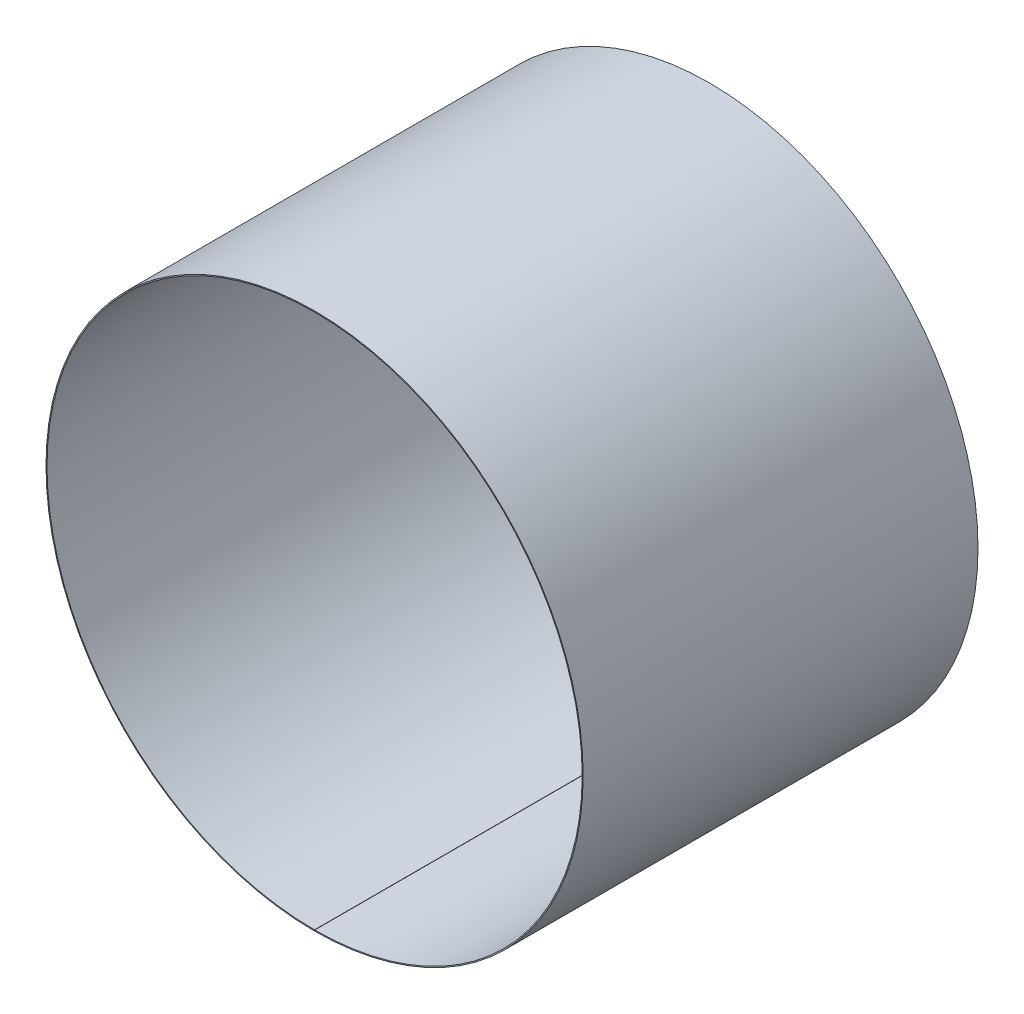
ISO-10303-21;
HEADER;
FILE_DESCRIPTION(('STEP AP214'),'2;1');
FILE_NAME('part.step','',(''),(''),'','','');
FILE_SCHEMA(('AUTOMOTIVE_DESIGN { 1 0 10303 214 1 1 1 1 }'));
ENDSEC;
DATA;
#1=APPLICATION_CONTEXT('core data for automotive mechanical design processes');
#2=APPLICATION_PROTOCOL_DEFINITION('international standard','automotive_design',2000,#1);
#3=PRODUCT_CONTEXT('',#1,'mechanical');
#4=PRODUCT('Part','Part','',(#3));
#5=PRODUCT_RELATED_PRODUCT_CATEGORY('part','',(#4));
#6=PRODUCT_DEFINITION_FORMATION('','',#4);
#7=PRODUCT_DEFINITION_CONTEXT('part definition',#1,'design');
#8=PRODUCT_DEFINITION('design','',#6,#7);
#9=PRODUCT_DEFINITION_SHAPE('','',#8);
#10=(LENGTH_UNIT() NAMED_UNIT(*) SI_UNIT(.MILLI.,.METRE.));
#11=(NAMED_UNIT(*) PLANE_ANGLE_UNIT() SI_UNIT($,.RADIAN.));
#12=(NAMED_UNIT(*) SI_UNIT($,.STERADIAN.) SOLID_ANGLE_UNIT());
#13=UNCERTAINTY_MEASURE_WITH_UNIT(LENGTH_MEASURE(1.E-05),#10,'distance_accuracy_value','');
#14=(GEOMETRIC_REPRESENTATION_CONTEXT(3) GLOBAL_UNCERTAINTY_ASSIGNED_CONTEXT((#13)) GLOBAL_UNIT_ASSIGNED_CONTEXT((#10,
#11,#12)) REPRESENTATION_CONTEXT('',''));
#15=CARTESIAN_POINT('',(0.,0.,0.));
#16=DIRECTION('',(0.,0.,1.));
#17=DIRECTION('',(1.,0.,0.));
#18=AXIS2_PLACEMENT_3D('',#15,#16,#17);
#19=CARTESIAN_POINT('',(3.32253755758183E-13,-1.11022302462516E-13,762.));
#20=DIRECTION('',(0.,0.,1.));
#21=DIRECTION('',(1.,0.,0.));
#22=AXIS2_PLACEMENT_3D('',#19,#20,#21);
#23=PLANE('',#22);
#24=DIRECTION('',(-0.000491865663494751,-0.999999879034077,0.));
#25=VECTOR('',#24,1.);
#26=CARTESIAN_POINT('',(-0.254474748738396,-517.366299057937,762.));
#27=LINE('',#26,#25);
#28=CARTESIAN_POINT('',(-0.254000000000181,-516.401099174693,762.));
#29=VERTEX_POINT('',#28);
#30=CARTESIAN_POINT('',(-0.254949497476992,-518.33149894118,762.));
#31=VERTEX_POINT('',#30);
#32=EDGE_CURVE('E11',#29,#31,#27,.T.);
#33=ORIENTED_EDGE('',*,*,#32,.F.);
#34=CARTESIAN_POINT('',(3.32253755758183E-13,-1.11022302462516E-13,762.));
#35=DIRECTION('',(0.,0.,1.));
#36=DIRECTION('',(1.,0.,0.));
#37=AXIS2_PLACEMENT_3D('',#34,#35,#36);
#38=CIRCLE('',#37,516.401161641636);
#39=CARTESIAN_POINT('',(0.2539999999924,-516.401099174693,762.));
#40=VERTEX_POINT('',#39);
#41=EDGE_CURVE('E98',#29,#40,#38,.F.);
#42=ORIENTED_EDGE('',*,*,#41,.T.);
#43=DIRECTION('',(0.000491865663478488,-0.999999879034077,0.));
#44=VECTOR('',#43,1.);
#45=CARTESIAN_POINT('',(0.254474748730647,-517.366299057937,762.));
#46=LINE('',#45,#44);
#47=CARTESIAN_POINT('',(0.254949497469179,-518.331498941181,762.));
#48=VERTEX_POINT('',#47);
#49=EDGE_CURVE('E46',#40,#48,#46,.T.);
#50=ORIENTED_EDGE('',*,*,#49,.T.);
#51=CARTESIAN_POINT('',(3.32253755758183E-13,-1.11022302462516E-13,762.));
#52=DIRECTION('',(0.,0.,1.));
#53=DIRECTION('',(1.,0.,0.));
#54=AXIS2_PLACEMENT_3D('',#51,#52,#53);
#55=CIRCLE('',#54,518.331561641636);
#56=EDGE_CURVE('E92',#31,#48,#55,.F.);
#57=ORIENTED_EDGE('',*,*,#56,.F.);
#58=EDGE_LOOP('',(#33,#42,#50,#57));
#59=FACE_BOUND('',#58,.T.);
#60=ADVANCED_FACE('F36',(#59),#23,.T.);
#61=CARTESIAN_POINT('',(0.254474748730647,-517.366299057937,381.));
#62=DIRECTION('',(-0.999999879034077,-0.000491865663478488,0.));
#63=DIRECTION('',(0.,0.,-1.));
#64=AXIS2_PLACEMENT_3D('',#61,#62,#63);
#65=PLANE('',#64);
#66=ORIENTED_EDGE('',*,*,#49,.F.);
#67=DIRECTION('',(0.,0.,1.));
#68=VECTOR('',#67,1.);
#69=CARTESIAN_POINT('',(0.2539999999924,-516.401099174693,-3338.33171375054));
#70=LINE('',#69,#68);
#71=CARTESIAN_POINT('',(0.2539999999924,-516.401099174693,0.));
#72=VERTEX_POINT('',#71);
#73=EDGE_CURVE('E80',#40,#72,#70,.F.);
#74=ORIENTED_EDGE('',*,*,#73,.T.);
#75=DIRECTION('',(0.000491865663478764,-0.999999879034077,0.));
#76=VECTOR('',#75,1.);
#77=CARTESIAN_POINT('',(0.254474748730789,-517.366299057937,0.));
#78=LINE('',#77,#76);
#79=CARTESIAN_POINT('',(0.254949497469179,-518.331498941181,0.));
#80=VERTEX_POINT('',#79);
#81=EDGE_CURVE('E75',#72,#80,#78,.T.);
#82=ORIENTED_EDGE('',*,*,#81,.T.);
#83=DIRECTION('',(0.,0.,1.));
#84=VECTOR('',#83,1.);
#85=CARTESIAN_POINT('',(0.254949497469179,-518.331498941181,-3338.33171375054));
#86=LINE('',#85,#84);
#87=EDGE_CURVE('E78',#48,#80,#86,.F.);
#88=ORIENTED_EDGE('',*,*,#87,.F.);
#89=EDGE_LOOP('',(#66,#74,#82,#88));
#90=FACE_BOUND('',#89,.T.);
#91=ADVANCED_FACE('F77',(#90),#65,.T.);
#92=CARTESIAN_POINT('',(3.32253755758183E-13,-1.11022302462516E-13,0.));
#93=DIRECTION('',(0.,0.,-1.));
#94=DIRECTION('',(-1.,0.,0.));
#95=AXIS2_PLACEMENT_3D('',#92,#93,#94);
#96=PLANE('',#95);
#97=ORIENTED_EDGE('',*,*,#81,.F.);
#98=CARTESIAN_POINT('',(3.32253755758183E-13,-1.11022302462516E-13,0.));
#99=DIRECTION('',(0.,0.,1.));
#100=DIRECTION('',(1.,0.,0.));
#101=AXIS2_PLACEMENT_3D('',#98,#99,#100);
#102=CIRCLE('',#101,516.401161641636);
#103=CARTESIAN_POINT('',(-0.254000000000181,-516.401099174693,0.));
#104=VERTEX_POINT('',#103);
#105=EDGE_CURVE('E104',#72,#104,#102,.T.);
#106=ORIENTED_EDGE('',*,*,#105,.T.);
#107=DIRECTION('',(-0.000491865663495118,-0.999999879034077,0.));
#108=VECTOR('',#107,1.);
#109=CARTESIAN_POINT('',(-0.254474748738586,-517.366299057937,0.));
#110=LINE('',#109,#108);
#111=CARTESIAN_POINT('',(-0.254949497476992,-518.33149894118,0.));
#112=VERTEX_POINT('',#111);
#113=EDGE_CURVE('E40',#104,#112,#110,.T.);
#114=ORIENTED_EDGE('',*,*,#113,.T.);
#115=CARTESIAN_POINT('',(3.32253755758183E-13,-1.11022302462516E-13,0.));
#116=DIRECTION('',(0.,0.,1.));
#117=DIRECTION('',(1.,0.,0.));
#118=AXIS2_PLACEMENT_3D('',#115,#116,#117);
#119=CIRCLE('',#118,518.331561641636);
#120=EDGE_CURVE('E91',#80,#112,#119,.T.);
#121=ORIENTED_EDGE('',*,*,#120,.F.);
#122=EDGE_LOOP('',(#97,#106,#114,#121));
#123=FACE_BOUND('',#122,.T.);
#124=ADVANCED_FACE('F94',(#123),#96,.T.);
#125=CARTESIAN_POINT('',(-0.254474748738404,-517.366299057937,381.));
#126=DIRECTION('',(0.999999879034077,-0.000491865663494766,0.));
#127=DIRECTION('',(0.,0.,1.));
#128=AXIS2_PLACEMENT_3D('',#125,#126,#127);
#129=PLANE('',#128);
#130=DIRECTION('',(0.,0.,1.));
#131=VECTOR('',#130,1.);
#132=CARTESIAN_POINT('',(-0.254000000000181,-516.401099174693,-3338.33171375054));
#133=LINE('',#132,#131);
#134=EDGE_CURVE('E96',#104,#29,#133,.T.);
#135=ORIENTED_EDGE('',*,*,#134,.T.);
#136=ORIENTED_EDGE('',*,*,#32,.T.);
#137=DIRECTION('',(0.,0.,1.));
#138=VECTOR('',#137,1.);
#139=CARTESIAN_POINT('',(-0.254949497476992,-518.33149894118,-3338.33171375054));
#140=LINE('',#139,#138);
#141=EDGE_CURVE('E102',#112,#31,#140,.T.);
#142=ORIENTED_EDGE('',*,*,#141,.F.);
#143=ORIENTED_EDGE('',*,*,#113,.F.);
#144=EDGE_LOOP('',(#135,#136,#142,#143));
#145=FACE_BOUND('',#144,.T.);
#146=ADVANCED_FACE('F38',(#145),#129,.T.);
#147=CARTESIAN_POINT('',(3.32253755758183E-13,-1.11022302462516E-13,-3338.33171375054));
#148=DIRECTION('',(0.,0.,1.));
#149=DIRECTION('',(1.,0.,0.));
#150=AXIS2_PLACEMENT_3D('',#147,#148,#149);
#151=CYLINDRICAL_SURFACE('',#150,518.331561641636);
#152=ORIENTED_EDGE('',*,*,#120,.T.);
#153=ORIENTED_EDGE('',*,*,#141,.T.);
#154=ORIENTED_EDGE('',*,*,#56,.T.);
#155=ORIENTED_EDGE('',*,*,#87,.T.);
#156=EDGE_LOOP('',(#152,#153,#154,#155));
#157=FACE_BOUND('',#156,.T.);
#158=ADVANCED_FACE('F89',(#157),#151,.T.);
#159=CARTESIAN_POINT('',(3.32253755758183E-13,-1.11022302462516E-13,-3338.33171375054));
#160=DIRECTION('',(0.,0.,1.));
#161=DIRECTION('',(1.,0.,0.));
#162=AXIS2_PLACEMENT_3D('',#159,#160,#161);
#163=CYLINDRICAL_SURFACE('',#162,516.401161641636);
#164=ORIENTED_EDGE('',*,*,#105,.F.);
#165=ORIENTED_EDGE('',*,*,#73,.F.);
#166=ORIENTED_EDGE('',*,*,#41,.F.);
#167=ORIENTED_EDGE('',*,*,#134,.F.);
#168=EDGE_LOOP('',(#164,#165,#166,#167));
#169=FACE_BOUND('',#168,.T.);
#170=ADVANCED_FACE('F109',(#169),#163,.F.);
#171=CLOSED_SHELL('',(#60,#91,#124,#146,#158,#170));
#172=MANIFOLD_SOLID_BREP('B2',#171);
#173=ADVANCED_BREP_SHAPE_REPRESENTATION('',(#18,#172),#14);
#174=SHAPE_DEFINITION_REPRESENTATION(#9,#173);
ENDSEC;
END-ISO-10303-21;
